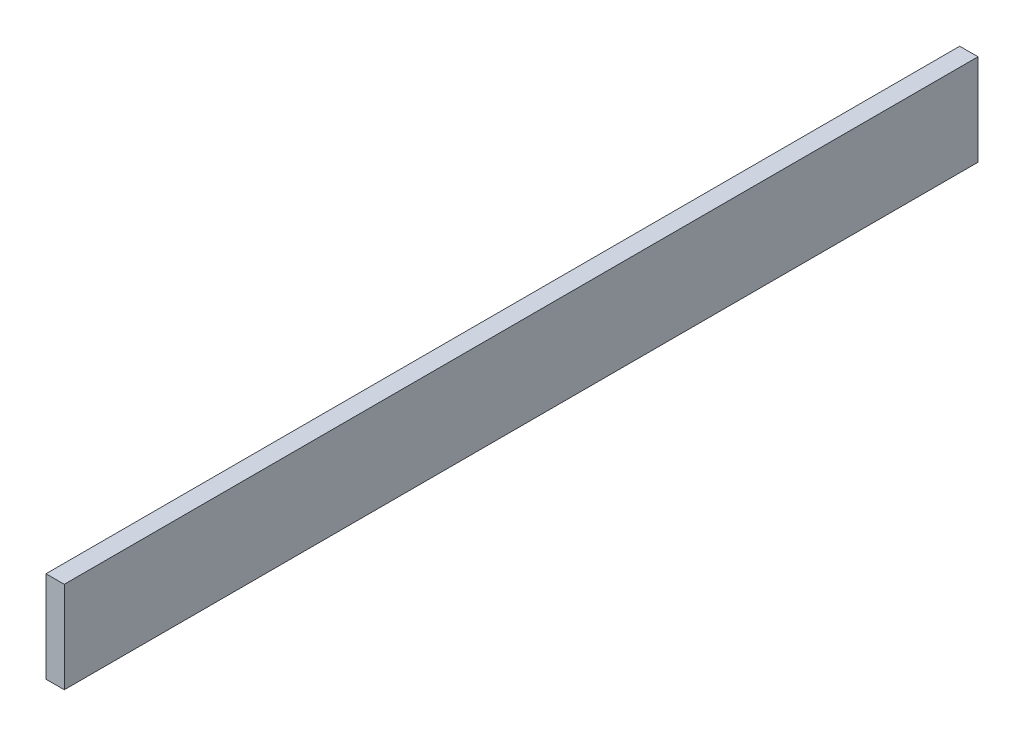
ISO-10303-21;
HEADER;
FILE_DESCRIPTION(('STEP AP214'),'2;1');
FILE_NAME('part.step','',(''),(''),'','','');
FILE_SCHEMA(('AUTOMOTIVE_DESIGN { 1 0 10303 214 1 1 1 1 }'));
ENDSEC;
DATA;
#1=APPLICATION_CONTEXT('core data for automotive mechanical design processes');
#2=APPLICATION_PROTOCOL_DEFINITION('international standard','automotive_design',2000,#1);
#3=PRODUCT_CONTEXT('',#1,'mechanical');
#4=PRODUCT('Part','Part','',(#3));
#5=PRODUCT_RELATED_PRODUCT_CATEGORY('part','',(#4));
#6=PRODUCT_DEFINITION_FORMATION('','',#4);
#7=PRODUCT_DEFINITION_CONTEXT('part definition',#1,'design');
#8=PRODUCT_DEFINITION('design','',#6,#7);
#9=PRODUCT_DEFINITION_SHAPE('','',#8);
#10=(LENGTH_UNIT() NAMED_UNIT(*) SI_UNIT(.MILLI.,.METRE.));
#11=(NAMED_UNIT(*) PLANE_ANGLE_UNIT() SI_UNIT($,.RADIAN.));
#12=(NAMED_UNIT(*) SI_UNIT($,.STERADIAN.) SOLID_ANGLE_UNIT());
#13=UNCERTAINTY_MEASURE_WITH_UNIT(LENGTH_MEASURE(1.E-05),#10,'distance_accuracy_value','');
#14=(GEOMETRIC_REPRESENTATION_CONTEXT(3) GLOBAL_UNCERTAINTY_ASSIGNED_CONTEXT((#13)) GLOBAL_UNIT_ASSIGNED_CONTEXT((#10,
#11,#12)) REPRESENTATION_CONTEXT('',''));
#15=CARTESIAN_POINT('',(0.,0.,0.));
#16=DIRECTION('',(0.,0.,1.));
#17=DIRECTION('',(1.,0.,0.));
#18=AXIS2_PLACEMENT_3D('',#15,#16,#17);
#19=CARTESIAN_POINT('',(9.99999999999999,50.,1000.));
#20=DIRECTION('',(-1.,0.,0.));
#21=DIRECTION('',(0.,-1.,0.));
#22=AXIS2_PLACEMENT_3D('',#19,#20,#21);
#23=PLANE('',#22);
#24=DIRECTION('',(0.,1.,0.));
#25=VECTOR('',#24,1.);
#26=CARTESIAN_POINT('',(9.99999999999999,50.,0.));
#27=LINE('',#26,#25);
#28=CARTESIAN_POINT('',(10.,-50.,0.));
#29=VERTEX_POINT('',#28);
#30=CARTESIAN_POINT('',(9.99999999999999,50.,0.));
#31=VERTEX_POINT('',#30);
#32=EDGE_CURVE('E96',#29,#31,#27,.T.);
#33=ORIENTED_EDGE('',*,*,#32,.T.);
#34=DIRECTION('',(0.,0.,-1.));
#35=VECTOR('',#34,1.);
#36=CARTESIAN_POINT('',(9.99999999999999,50.,1000.));
#37=LINE('',#36,#35);
#38=CARTESIAN_POINT('',(9.99999999999999,50.,1000.));
#39=VERTEX_POINT('',#38);
#40=EDGE_CURVE('E11',#39,#31,#37,.T.);
#41=ORIENTED_EDGE('',*,*,#40,.F.);
#42=DIRECTION('',(0.,1.,0.));
#43=VECTOR('',#42,1.);
#44=CARTESIAN_POINT('',(9.99999999999999,50.,1000.));
#45=LINE('',#44,#43);
#46=CARTESIAN_POINT('',(10.,-50.,1000.));
#47=VERTEX_POINT('',#46);
#48=EDGE_CURVE('E84',#47,#39,#45,.T.);
#49=ORIENTED_EDGE('',*,*,#48,.F.);
#50=DIRECTION('',(0.,0.,-1.));
#51=VECTOR('',#50,1.);
#52=CARTESIAN_POINT('',(10.,-50.,1000.));
#53=LINE('',#52,#51);
#54=EDGE_CURVE('E92',#47,#29,#53,.T.);
#55=ORIENTED_EDGE('',*,*,#54,.T.);
#56=EDGE_LOOP('',(#33,#41,#49,#55));
#57=FACE_BOUND('',#56,.T.);
#58=ADVANCED_FACE('F33',(#57),#23,.F.);
#59=CARTESIAN_POINT('',(-10.,50.,1000.));
#60=DIRECTION('',(0.,-1.,0.));
#61=DIRECTION('',(0.,0.,-1.));
#62=AXIS2_PLACEMENT_3D('',#59,#60,#61);
#63=PLANE('',#62);
#64=DIRECTION('',(-1.,0.,0.));
#65=VECTOR('',#64,1.);
#66=CARTESIAN_POINT('',(-10.,50.,0.));
#67=LINE('',#66,#65);
#68=CARTESIAN_POINT('',(-10.,50.,0.));
#69=VERTEX_POINT('',#68);
#70=EDGE_CURVE('E88',#31,#69,#67,.T.);
#71=ORIENTED_EDGE('',*,*,#70,.T.);
#72=DIRECTION('',(0.,0.,-1.));
#73=VECTOR('',#72,1.);
#74=CARTESIAN_POINT('',(-10.,50.,1000.));
#75=LINE('',#74,#73);
#76=CARTESIAN_POINT('',(-10.,50.,1000.));
#77=VERTEX_POINT('',#76);
#78=EDGE_CURVE('E41',#77,#69,#75,.T.);
#79=ORIENTED_EDGE('',*,*,#78,.F.);
#80=DIRECTION('',(-1.,0.,0.));
#81=VECTOR('',#80,1.);
#82=CARTESIAN_POINT('',(-10.,50.,1000.));
#83=LINE('',#82,#81);
#84=EDGE_CURVE('E79',#39,#77,#83,.T.);
#85=ORIENTED_EDGE('',*,*,#84,.F.);
#86=ORIENTED_EDGE('',*,*,#40,.T.);
#87=EDGE_LOOP('',(#71,#79,#85,#86));
#88=FACE_BOUND('',#87,.T.);
#89=ADVANCED_FACE('F87',(#88),#63,.F.);
#90=CARTESIAN_POINT('',(-10.,50.,1000.));
#91=DIRECTION('',(1.,0.,0.));
#92=DIRECTION('',(0.,1.,0.));
#93=AXIS2_PLACEMENT_3D('',#90,#91,#92);
#94=PLANE('',#93);
#95=DIRECTION('',(0.,-1.,0.));
#96=VECTOR('',#95,1.);
#97=CARTESIAN_POINT('',(-10.,50.,0.));
#98=LINE('',#97,#96);
#99=CARTESIAN_POINT('',(-9.99999999999999,-50.,0.));
#100=VERTEX_POINT('',#99);
#101=EDGE_CURVE('E66',#69,#100,#98,.T.);
#102=ORIENTED_EDGE('',*,*,#101,.T.);
#103=DIRECTION('',(0.,0.,-1.));
#104=VECTOR('',#103,1.);
#105=CARTESIAN_POINT('',(-9.99999999999999,-50.,1000.));
#106=LINE('',#105,#104);
#107=CARTESIAN_POINT('',(-9.99999999999999,-50.,1000.));
#108=VERTEX_POINT('',#107);
#109=EDGE_CURVE('E89',#108,#100,#106,.T.);
#110=ORIENTED_EDGE('',*,*,#109,.F.);
#111=DIRECTION('',(0.,-1.,0.));
#112=VECTOR('',#111,1.);
#113=CARTESIAN_POINT('',(-10.,50.,1000.));
#114=LINE('',#113,#112);
#115=EDGE_CURVE('E82',#77,#108,#114,.T.);
#116=ORIENTED_EDGE('',*,*,#115,.F.);
#117=ORIENTED_EDGE('',*,*,#78,.T.);
#118=EDGE_LOOP('',(#102,#110,#116,#117));
#119=FACE_BOUND('',#118,.T.);
#120=ADVANCED_FACE('F90',(#119),#94,.F.);
#121=CARTESIAN_POINT('',(-9.99999999999999,-50.,1000.));
#122=DIRECTION('',(0.,1.,0.));
#123=DIRECTION('',(0.,0.,1.));
#124=AXIS2_PLACEMENT_3D('',#121,#122,#123);
#125=PLANE('',#124);
#126=DIRECTION('',(1.,0.,0.));
#127=VECTOR('',#126,1.);
#128=CARTESIAN_POINT('',(-9.99999999999999,-50.,0.));
#129=LINE('',#128,#127);
#130=EDGE_CURVE('E72',#100,#29,#129,.T.);
#131=ORIENTED_EDGE('',*,*,#130,.T.);
#132=ORIENTED_EDGE('',*,*,#54,.F.);
#133=DIRECTION('',(1.,0.,0.));
#134=VECTOR('',#133,1.);
#135=CARTESIAN_POINT('',(-9.99999999999999,-50.,1000.));
#136=LINE('',#135,#134);
#137=EDGE_CURVE('E49',#108,#47,#136,.T.);
#138=ORIENTED_EDGE('',*,*,#137,.F.);
#139=ORIENTED_EDGE('',*,*,#109,.T.);
#140=EDGE_LOOP('',(#131,#132,#138,#139));
#141=FACE_BOUND('',#140,.T.);
#142=ADVANCED_FACE('F103',(#141),#125,.F.);
#143=CARTESIAN_POINT('',(0.,0.,1000.));
#144=DIRECTION('',(0.,0.,1.));
#145=DIRECTION('',(1.,0.,0.));
#146=AXIS2_PLACEMENT_3D('',#143,#144,#145);
#147=PLANE('',#146);
#148=ORIENTED_EDGE('',*,*,#48,.T.);
#149=ORIENTED_EDGE('',*,*,#84,.T.);
#150=ORIENTED_EDGE('',*,*,#115,.T.);
#151=ORIENTED_EDGE('',*,*,#137,.T.);
#152=EDGE_LOOP('',(#148,#149,#150,#151));
#153=FACE_BOUND('',#152,.T.);
#154=ADVANCED_FACE('F80',(#153),#147,.T.);
#155=CARTESIAN_POINT('',(0.,0.,0.));
#156=DIRECTION('',(0.,0.,1.));
#157=DIRECTION('',(1.,0.,0.));
#158=AXIS2_PLACEMENT_3D('',#155,#156,#157);
#159=PLANE('',#158);
#160=ORIENTED_EDGE('',*,*,#32,.F.);
#161=ORIENTED_EDGE('',*,*,#130,.F.);
#162=ORIENTED_EDGE('',*,*,#101,.F.);
#163=ORIENTED_EDGE('',*,*,#70,.F.);
#164=EDGE_LOOP('',(#160,#161,#162,#163));
#165=FACE_BOUND('',#164,.T.);
#166=ADVANCED_FACE('F106',(#165),#159,.F.);
#167=CLOSED_SHELL('',(#58,#89,#120,#142,#154,#166));
#168=MANIFOLD_SOLID_BREP('B2',#167);
#169=ADVANCED_BREP_SHAPE_REPRESENTATION('',(#18,#168),#14);
#170=SHAPE_DEFINITION_REPRESENTATION(#9,#169);
ENDSEC;
END-ISO-10303-21;
